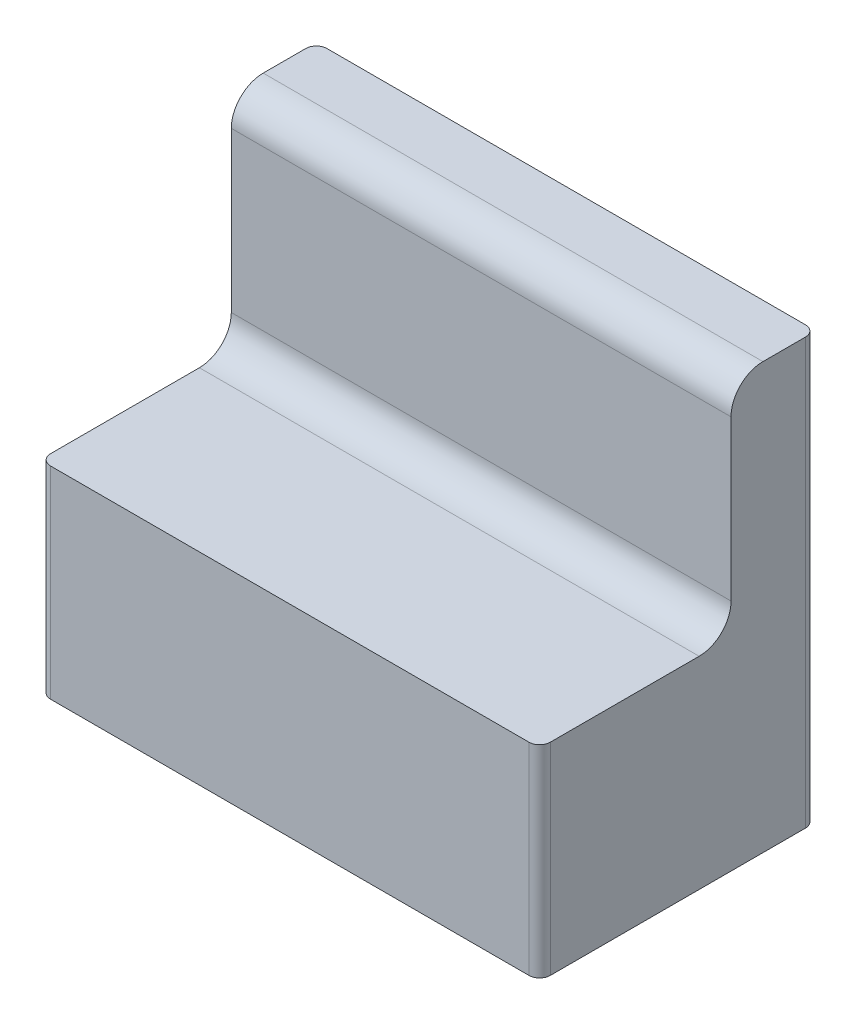
ISO-10303-21;
HEADER;
FILE_DESCRIPTION(('STEP AP214'),'2;1');
FILE_NAME('part.step','',(''),(''),'','','');
FILE_SCHEMA(('AUTOMOTIVE_DESIGN { 1 0 10303 214 1 1 1 1 }'));
ENDSEC;
DATA;
#1=APPLICATION_CONTEXT('core data for automotive mechanical design processes');
#2=APPLICATION_PROTOCOL_DEFINITION('international standard','automotive_design',2000,#1);
#3=PRODUCT_CONTEXT('',#1,'mechanical');
#4=PRODUCT('Part','Part','',(#3));
#5=PRODUCT_RELATED_PRODUCT_CATEGORY('part','',(#4));
#6=PRODUCT_DEFINITION_FORMATION('','',#4);
#7=PRODUCT_DEFINITION_CONTEXT('part definition',#1,'design');
#8=PRODUCT_DEFINITION('design','',#6,#7);
#9=PRODUCT_DEFINITION_SHAPE('','',#8);
#10=(LENGTH_UNIT() NAMED_UNIT(*) SI_UNIT(.MILLI.,.METRE.));
#11=(NAMED_UNIT(*) PLANE_ANGLE_UNIT() SI_UNIT($,.RADIAN.));
#12=(NAMED_UNIT(*) SI_UNIT($,.STERADIAN.) SOLID_ANGLE_UNIT());
#13=UNCERTAINTY_MEASURE_WITH_UNIT(LENGTH_MEASURE(1.E-05),#10,'distance_accuracy_value','');
#14=(GEOMETRIC_REPRESENTATION_CONTEXT(3) GLOBAL_UNCERTAINTY_ASSIGNED_CONTEXT((#13)) GLOBAL_UNIT_ASSIGNED_CONTEXT((#10,
#11,#12)) REPRESENTATION_CONTEXT('',''));
#15=CARTESIAN_POINT('',(0.,0.,0.));
#16=DIRECTION('',(0.,0.,1.));
#17=DIRECTION('',(1.,0.,0.));
#18=AXIS2_PLACEMENT_3D('',#15,#16,#17);
#19=CARTESIAN_POINT('',(23.5,-40.,13.));
#20=DIRECTION('',(1.,0.,0.));
#21=DIRECTION('',(0.,0.,-1.));
#22=AXIS2_PLACEMENT_3D('',#19,#20,#21);
#23=PLANE('',#22);
#24=DIRECTION('',(0.,0.,-1.));
#25=VECTOR('',#24,1.);
#26=CARTESIAN_POINT('',(23.5,-40.,13.));
#27=LINE('',#26,#25);
#28=CARTESIAN_POINT('',(23.5,-40.,12.));
#29=VERTEX_POINT('',#28);
#30=CARTESIAN_POINT('',(23.5,-40.,-12.));
#31=VERTEX_POINT('',#30);
#32=EDGE_CURVE('E187',#29,#31,#27,.T.);
#33=ORIENTED_EDGE('',*,*,#32,.T.);
#34=DIRECTION('',(0.,1.,0.));
#35=VECTOR('',#34,1.);
#36=CARTESIAN_POINT('',(23.5,-40.,-12.));
#37=LINE('',#36,#35);
#38=CARTESIAN_POINT('',(23.5,0.,-12.));
#39=VERTEX_POINT('',#38);
#40=EDGE_CURVE('E229',#31,#39,#37,.T.);
#41=ORIENTED_EDGE('',*,*,#40,.T.);
#42=DIRECTION('',(0.,0.,-1.));
#43=VECTOR('',#42,1.);
#44=CARTESIAN_POINT('',(23.5,0.,13.));
#45=LINE('',#44,#43);
#46=CARTESIAN_POINT('',(23.5,0.,-8.));
#47=VERTEX_POINT('',#46);
#48=EDGE_CURVE('E186',#47,#39,#45,.T.);
#49=ORIENTED_EDGE('',*,*,#48,.F.);
#50=CARTESIAN_POINT('',(23.5,-3.,-8.));
#51=DIRECTION('',(1.,0.,0.));
#52=DIRECTION('',(0.,0.,-1.));
#53=AXIS2_PLACEMENT_3D('',#50,#51,#52);
#54=CIRCLE('',#53,3.);
#55=CARTESIAN_POINT('',(23.5,-3.,-5.));
#56=VERTEX_POINT('',#55);
#57=EDGE_CURVE('E209',#47,#56,#54,.T.);
#58=ORIENTED_EDGE('',*,*,#57,.T.);
#59=DIRECTION('',(0.,1.,0.));
#60=VECTOR('',#59,1.);
#61=CARTESIAN_POINT('',(23.5,0.,-5.));
#62=LINE('',#61,#60);
#63=CARTESIAN_POINT('',(23.5,-18.,-5.));
#64=VERTEX_POINT('',#63);
#65=EDGE_CURVE('E178',#64,#56,#62,.T.);
#66=ORIENTED_EDGE('',*,*,#65,.F.);
#67=CARTESIAN_POINT('',(23.5,-18.,-2.));
#68=DIRECTION('',(1.,0.,0.));
#69=DIRECTION('',(0.,0.,-1.));
#70=AXIS2_PLACEMENT_3D('',#67,#68,#69);
#71=CIRCLE('',#70,3.);
#72=CARTESIAN_POINT('',(23.5,-21.,-2.));
#73=VERTEX_POINT('',#72);
#74=EDGE_CURVE('E222',#64,#73,#71,.F.);
#75=ORIENTED_EDGE('',*,*,#74,.T.);
#76=DIRECTION('',(0.,0.,-1.));
#77=VECTOR('',#76,1.);
#78=CARTESIAN_POINT('',(23.5,-21.,13.));
#79=LINE('',#78,#77);
#80=CARTESIAN_POINT('',(23.5,-21.,12.));
#81=VERTEX_POINT('',#80);
#82=EDGE_CURVE('E176',#81,#73,#79,.T.);
#83=ORIENTED_EDGE('',*,*,#82,.F.);
#84=DIRECTION('',(0.,1.,0.));
#85=VECTOR('',#84,1.);
#86=CARTESIAN_POINT('',(23.5,-40.,12.));
#87=LINE('',#86,#85);
#88=EDGE_CURVE('E227',#81,#29,#87,.F.);
#89=ORIENTED_EDGE('',*,*,#88,.T.);
#90=EDGE_LOOP('',(#33,#41,#49,#58,#66,#75,#83,#89));
#91=FACE_BOUND('',#90,.T.);
#92=ADVANCED_FACE('F53',(#91),#23,.T.);
#93=CARTESIAN_POINT('',(-23.5,-40.,13.));
#94=DIRECTION('',(0.,0.,1.));
#95=DIRECTION('',(1.,0.,0.));
#96=AXIS2_PLACEMENT_3D('',#93,#94,#95);
#97=PLANE('',#96);
#98=DIRECTION('',(1.,0.,0.));
#99=VECTOR('',#98,1.);
#100=CARTESIAN_POINT('',(-23.5,-40.,13.));
#101=LINE('',#100,#99);
#102=CARTESIAN_POINT('',(-22.5,-40.,13.));
#103=VERTEX_POINT('',#102);
#104=CARTESIAN_POINT('',(22.5,-40.,13.));
#105=VERTEX_POINT('',#104);
#106=EDGE_CURVE('E197',#103,#105,#101,.T.);
#107=ORIENTED_EDGE('',*,*,#106,.T.);
#108=DIRECTION('',(0.,1.,0.));
#109=VECTOR('',#108,1.);
#110=CARTESIAN_POINT('',(22.5,-40.,13.));
#111=LINE('',#110,#109);
#112=CARTESIAN_POINT('',(22.5,-21.,13.));
#113=VERTEX_POINT('',#112);
#114=EDGE_CURVE('E251',#105,#113,#111,.T.);
#115=ORIENTED_EDGE('',*,*,#114,.T.);
#116=DIRECTION('',(1.,0.,0.));
#117=VECTOR('',#116,1.);
#118=CARTESIAN_POINT('',(-23.501,-21.,13.));
#119=LINE('',#118,#117);
#120=CARTESIAN_POINT('',(-22.5,-21.,13.));
#121=VERTEX_POINT('',#120);
#122=EDGE_CURVE('E181',#121,#113,#119,.T.);
#123=ORIENTED_EDGE('',*,*,#122,.F.);
#124=DIRECTION('',(0.,1.,0.));
#125=VECTOR('',#124,1.);
#126=CARTESIAN_POINT('',(-22.5,-40.,13.));
#127=LINE('',#126,#125);
#128=EDGE_CURVE('E249',#121,#103,#127,.F.);
#129=ORIENTED_EDGE('',*,*,#128,.T.);
#130=EDGE_LOOP('',(#107,#115,#123,#129));
#131=FACE_BOUND('',#130,.T.);
#132=ADVANCED_FACE('F285',(#131),#97,.T.);
#133=CARTESIAN_POINT('',(-23.5,-40.,13.));
#134=DIRECTION('',(-1.,0.,0.));
#135=DIRECTION('',(0.,0.,1.));
#136=AXIS2_PLACEMENT_3D('',#133,#134,#135);
#137=PLANE('',#136);
#138=DIRECTION('',(0.,0.,1.));
#139=VECTOR('',#138,1.);
#140=CARTESIAN_POINT('',(-23.5,-40.,13.));
#141=LINE('',#140,#139);
#142=CARTESIAN_POINT('',(-23.5,-40.,-12.));
#143=VERTEX_POINT('',#142);
#144=CARTESIAN_POINT('',(-23.5,-40.,12.));
#145=VERTEX_POINT('',#144);
#146=EDGE_CURVE('E194',#143,#145,#141,.T.);
#147=ORIENTED_EDGE('',*,*,#146,.T.);
#148=DIRECTION('',(0.,1.,0.));
#149=VECTOR('',#148,1.);
#150=CARTESIAN_POINT('',(-23.5,-40.,12.));
#151=LINE('',#150,#149);
#152=CARTESIAN_POINT('',(-23.5,-21.,12.));
#153=VERTEX_POINT('',#152);
#154=EDGE_CURVE('E11',#145,#153,#151,.T.);
#155=ORIENTED_EDGE('',*,*,#154,.T.);
#156=DIRECTION('',(0.,0.,-1.));
#157=VECTOR('',#156,1.);
#158=CARTESIAN_POINT('',(-23.5,-21.,13.));
#159=LINE('',#158,#157);
#160=CARTESIAN_POINT('',(-23.5,-21.,-2.));
#161=VERTEX_POINT('',#160);
#162=EDGE_CURVE('E184',#153,#161,#159,.T.);
#163=ORIENTED_EDGE('',*,*,#162,.T.);
#164=CARTESIAN_POINT('',(-23.5,-18.,-2.));
#165=DIRECTION('',(-1.,0.,0.));
#166=DIRECTION('',(0.,0.,1.));
#167=AXIS2_PLACEMENT_3D('',#164,#165,#166);
#168=CIRCLE('',#167,3.);
#169=CARTESIAN_POINT('',(-23.5,-18.,-5.));
#170=VERTEX_POINT('',#169);
#171=EDGE_CURVE('E225',#161,#170,#168,.F.);
#172=ORIENTED_EDGE('',*,*,#171,.T.);
#173=DIRECTION('',(0.,1.,0.));
#174=VECTOR('',#173,1.);
#175=CARTESIAN_POINT('',(-23.5,0.,-5.));
#176=LINE('',#175,#174);
#177=CARTESIAN_POINT('',(-23.5,-3.,-5.));
#178=VERTEX_POINT('',#177);
#179=EDGE_CURVE('E173',#170,#178,#176,.T.);
#180=ORIENTED_EDGE('',*,*,#179,.T.);
#181=CARTESIAN_POINT('',(-23.5,-3.,-8.));
#182=DIRECTION('',(-1.,0.,0.));
#183=DIRECTION('',(0.,0.,1.));
#184=AXIS2_PLACEMENT_3D('',#181,#182,#183);
#185=CIRCLE('',#184,3.);
#186=CARTESIAN_POINT('',(-23.5,0.,-8.));
#187=VERTEX_POINT('',#186);
#188=EDGE_CURVE('E216',#178,#187,#185,.T.);
#189=ORIENTED_EDGE('',*,*,#188,.T.);
#190=DIRECTION('',(0.,0.,1.));
#191=VECTOR('',#190,1.);
#192=CARTESIAN_POINT('',(-23.5,0.,13.));
#193=LINE('',#192,#191);
#194=CARTESIAN_POINT('',(-23.5,0.,-12.));
#195=VERTEX_POINT('',#194);
#196=EDGE_CURVE('E191',#195,#187,#193,.T.);
#197=ORIENTED_EDGE('',*,*,#196,.F.);
#198=DIRECTION('',(0.,1.,0.));
#199=VECTOR('',#198,1.);
#200=CARTESIAN_POINT('',(-23.5,-40.,-12.));
#201=LINE('',#200,#199);
#202=EDGE_CURVE('E61',#195,#143,#201,.F.);
#203=ORIENTED_EDGE('',*,*,#202,.T.);
#204=EDGE_LOOP('',(#147,#155,#163,#172,#180,#189,#197,#203));
#205=FACE_BOUND('',#204,.T.);
#206=ADVANCED_FACE('F258',(#205),#137,.T.);
#207=CARTESIAN_POINT('',(-23.5,-40.,-13.));
#208=DIRECTION('',(0.,0.,-1.));
#209=DIRECTION('',(-1.,0.,0.));
#210=AXIS2_PLACEMENT_3D('',#207,#208,#209);
#211=PLANE('',#210);
#212=DIRECTION('',(-1.,0.,0.));
#213=VECTOR('',#212,1.);
#214=CARTESIAN_POINT('',(-23.5,0.,-13.));
#215=LINE('',#214,#213);
#216=CARTESIAN_POINT('',(22.5,0.,-13.));
#217=VERTEX_POINT('',#216);
#218=CARTESIAN_POINT('',(-22.5,0.,-13.));
#219=VERTEX_POINT('',#218);
#220=EDGE_CURVE('E203',#217,#219,#215,.T.);
#221=ORIENTED_EDGE('',*,*,#220,.F.);
#222=DIRECTION('',(0.,1.,0.));
#223=VECTOR('',#222,1.);
#224=CARTESIAN_POINT('',(22.5,-40.,-13.));
#225=LINE('',#224,#223);
#226=CARTESIAN_POINT('',(22.5,-40.,-13.));
#227=VERTEX_POINT('',#226);
#228=EDGE_CURVE('E239',#217,#227,#225,.F.);
#229=ORIENTED_EDGE('',*,*,#228,.T.);
#230=DIRECTION('',(-1.,0.,0.));
#231=VECTOR('',#230,1.);
#232=CARTESIAN_POINT('',(-23.5,-40.,-13.));
#233=LINE('',#232,#231);
#234=CARTESIAN_POINT('',(-22.5,-40.,-13.));
#235=VERTEX_POINT('',#234);
#236=EDGE_CURVE('E190',#227,#235,#233,.T.);
#237=ORIENTED_EDGE('',*,*,#236,.T.);
#238=DIRECTION('',(0.,1.,0.));
#239=VECTOR('',#238,1.);
#240=CARTESIAN_POINT('',(-22.5,-40.,-13.));
#241=LINE('',#240,#239);
#242=EDGE_CURVE('E236',#235,#219,#241,.T.);
#243=ORIENTED_EDGE('',*,*,#242,.T.);
#244=EDGE_LOOP('',(#221,#229,#237,#243));
#245=FACE_BOUND('',#244,.T.);
#246=ADVANCED_FACE('F269',(#245),#211,.T.);
#247=CARTESIAN_POINT('',(0.,-40.,0.));
#248=DIRECTION('',(0.,-1.,0.));
#249=DIRECTION('',(0.,0.,-1.));
#250=AXIS2_PLACEMENT_3D('',#247,#248,#249);
#251=PLANE('',#250);
#252=CARTESIAN_POINT('',(15.5,-40.,0.));
#253=DIRECTION('',(0.,-1.,0.));
#254=DIRECTION('',(0.,0.,-1.));
#255=AXIS2_PLACEMENT_3D('',#252,#253,#254);
#256=CIRCLE('',#255,3.025);
#257=CARTESIAN_POINT('',(15.5,-40.,-3.025));
#258=VERTEX_POINT('',#257);
#259=EDGE_CURVE('E164',#258,#258,#256,.T.);
#260=ORIENTED_EDGE('',*,*,#259,.F.);
#261=EDGE_LOOP('',(#260));
#262=FACE_BOUND('',#261,.T.);
#263=CARTESIAN_POINT('',(-15.5,-40.,0.));
#264=DIRECTION('',(0.,-1.,0.));
#265=DIRECTION('',(0.,0.,-1.));
#266=AXIS2_PLACEMENT_3D('',#263,#264,#265);
#267=CIRCLE('',#266,3.025);
#268=CARTESIAN_POINT('',(-15.5,-40.,-3.025));
#269=VERTEX_POINT('',#268);
#270=EDGE_CURVE('E157',#269,#269,#267,.T.);
#271=ORIENTED_EDGE('',*,*,#270,.F.);
#272=EDGE_LOOP('',(#271));
#273=FACE_BOUND('',#272,.T.);
#274=ORIENTED_EDGE('',*,*,#236,.F.);
#275=CARTESIAN_POINT('',(22.5,-40.,-12.));
#276=DIRECTION('',(0.,-1.,0.));
#277=DIRECTION('',(0.,0.,-1.));
#278=AXIS2_PLACEMENT_3D('',#275,#276,#277);
#279=CIRCLE('',#278,1.);
#280=EDGE_CURVE('E247',#227,#31,#279,.T.);
#281=ORIENTED_EDGE('',*,*,#280,.T.);
#282=ORIENTED_EDGE('',*,*,#32,.F.);
#283=CARTESIAN_POINT('',(22.5,-40.,12.));
#284=DIRECTION('',(0.,-1.,0.));
#285=DIRECTION('',(0.,0.,-1.));
#286=AXIS2_PLACEMENT_3D('',#283,#284,#285);
#287=CIRCLE('',#286,1.);
#288=EDGE_CURVE('E245',#29,#105,#287,.T.);
#289=ORIENTED_EDGE('',*,*,#288,.T.);
#290=ORIENTED_EDGE('',*,*,#106,.F.);
#291=CARTESIAN_POINT('',(-22.5,-40.,12.));
#292=DIRECTION('',(0.,-1.,0.));
#293=DIRECTION('',(0.,0.,-1.));
#294=AXIS2_PLACEMENT_3D('',#291,#292,#293);
#295=CIRCLE('',#294,1.);
#296=EDGE_CURVE('E243',#103,#145,#295,.T.);
#297=ORIENTED_EDGE('',*,*,#296,.T.);
#298=ORIENTED_EDGE('',*,*,#146,.F.);
#299=CARTESIAN_POINT('',(-22.5,-40.,-12.));
#300=DIRECTION('',(0.,-1.,0.));
#301=DIRECTION('',(0.,0.,-1.));
#302=AXIS2_PLACEMENT_3D('',#299,#300,#301);
#303=CIRCLE('',#302,1.);
#304=EDGE_CURVE('E241',#143,#235,#303,.T.);
#305=ORIENTED_EDGE('',*,*,#304,.T.);
#306=EDGE_LOOP('',(#274,#281,#282,#289,#290,#297,#298,#305));
#307=FACE_BOUND('',#306,.T.);
#308=ADVANCED_FACE('F263',(#262,#273,#307),#251,.T.);
#309=CARTESIAN_POINT('',(0.,0.,0.));
#310=DIRECTION('',(0.,-1.,0.));
#311=DIRECTION('',(0.,0.,-1.));
#312=AXIS2_PLACEMENT_3D('',#309,#310,#311);
#313=PLANE('',#312);
#314=ORIENTED_EDGE('',*,*,#48,.T.);
#315=CARTESIAN_POINT('',(22.5,0.,-12.));
#316=DIRECTION('',(0.,-1.,0.));
#317=DIRECTION('',(0.,0.,-1.));
#318=AXIS2_PLACEMENT_3D('',#315,#316,#317);
#319=CIRCLE('',#318,1.);
#320=EDGE_CURVE('E234',#39,#217,#319,.F.);
#321=ORIENTED_EDGE('',*,*,#320,.T.);
#322=ORIENTED_EDGE('',*,*,#220,.T.);
#323=CARTESIAN_POINT('',(-22.5,0.,-12.));
#324=DIRECTION('',(0.,-1.,0.));
#325=DIRECTION('',(0.,0.,-1.));
#326=AXIS2_PLACEMENT_3D('',#323,#324,#325);
#327=CIRCLE('',#326,1.);
#328=EDGE_CURVE('E232',#219,#195,#327,.F.);
#329=ORIENTED_EDGE('',*,*,#328,.T.);
#330=ORIENTED_EDGE('',*,*,#196,.T.);
#331=DIRECTION('',(1.,0.,0.));
#332=VECTOR('',#331,1.);
#333=CARTESIAN_POINT('',(0.,0.,-8.));
#334=LINE('',#333,#332);
#335=EDGE_CURVE('E200',#187,#47,#334,.T.);
#336=ORIENTED_EDGE('',*,*,#335,.T.);
#337=EDGE_LOOP('',(#314,#321,#322,#329,#330,#336));
#338=FACE_BOUND('',#337,.T.);
#339=ADVANCED_FACE('F272',(#338),#313,.F.);
#340=CARTESIAN_POINT('',(-23.501,0.,-5.));
#341=DIRECTION('',(0.,0.,-1.));
#342=DIRECTION('',(0.,1.,0.));
#343=AXIS2_PLACEMENT_3D('',#340,#341,#342);
#344=PLANE('',#343);
#345=ORIENTED_EDGE('',*,*,#65,.T.);
#346=DIRECTION('',(1.,0.,0.));
#347=VECTOR('',#346,1.);
#348=CARTESIAN_POINT('',(-23.501,-3.,-5.));
#349=LINE('',#348,#347);
#350=EDGE_CURVE('E214',#56,#178,#349,.F.);
#351=ORIENTED_EDGE('',*,*,#350,.T.);
#352=ORIENTED_EDGE('',*,*,#179,.F.);
#353=DIRECTION('',(1.,0.,0.));
#354=VECTOR('',#353,1.);
#355=CARTESIAN_POINT('',(23.5,-18.,-5.));
#356=LINE('',#355,#354);
#357=EDGE_CURVE('E211',#170,#64,#356,.T.);
#358=ORIENTED_EDGE('',*,*,#357,.T.);
#359=EDGE_LOOP('',(#345,#351,#352,#358));
#360=FACE_BOUND('',#359,.T.);
#361=ADVANCED_FACE('F344',(#360),#344,.F.);
#362=CARTESIAN_POINT('',(-23.501,-21.,13.));
#363=DIRECTION('',(0.,-1.,0.));
#364=DIRECTION('',(0.,0.,-1.));
#365=AXIS2_PLACEMENT_3D('',#362,#363,#364);
#366=PLANE('',#365);
#367=ORIENTED_EDGE('',*,*,#122,.T.);
#368=CARTESIAN_POINT('',(22.5,-21.,12.));
#369=DIRECTION('',(0.,-1.,0.));
#370=DIRECTION('',(0.,0.,-1.));
#371=AXIS2_PLACEMENT_3D('',#368,#369,#370);
#372=CIRCLE('',#371,1.);
#373=EDGE_CURVE('E75',#113,#81,#372,.F.);
#374=ORIENTED_EDGE('',*,*,#373,.T.);
#375=ORIENTED_EDGE('',*,*,#82,.T.);
#376=DIRECTION('',(1.,0.,0.));
#377=VECTOR('',#376,1.);
#378=CARTESIAN_POINT('',(-23.5,-21.,-2.));
#379=LINE('',#378,#377);
#380=EDGE_CURVE('E219',#73,#161,#379,.F.);
#381=ORIENTED_EDGE('',*,*,#380,.T.);
#382=ORIENTED_EDGE('',*,*,#162,.F.);
#383=CARTESIAN_POINT('',(-22.5,-21.,12.));
#384=DIRECTION('',(0.,-1.,0.));
#385=DIRECTION('',(0.,0.,-1.));
#386=AXIS2_PLACEMENT_3D('',#383,#384,#385);
#387=CIRCLE('',#386,1.);
#388=EDGE_CURVE('E68',#153,#121,#387,.F.);
#389=ORIENTED_EDGE('',*,*,#388,.T.);
#390=EDGE_LOOP('',(#367,#374,#375,#381,#382,#389));
#391=FACE_BOUND('',#390,.T.);
#392=ADVANCED_FACE('F287',(#391),#366,.F.);
#393=CARTESIAN_POINT('',(0.,-3.,-8.));
#394=DIRECTION('',(1.,0.,0.));
#395=DIRECTION('',(0.,0.,-1.));
#396=AXIS2_PLACEMENT_3D('',#393,#394,#395);
#397=CYLINDRICAL_SURFACE('',#396,3.);
#398=ORIENTED_EDGE('',*,*,#188,.F.);
#399=ORIENTED_EDGE('',*,*,#350,.F.);
#400=ORIENTED_EDGE('',*,*,#57,.F.);
#401=ORIENTED_EDGE('',*,*,#335,.F.);
#402=EDGE_LOOP('',(#398,#399,#400,#401));
#403=FACE_BOUND('',#402,.T.);
#404=ADVANCED_FACE('F309',(#403),#397,.T.);
#405=CARTESIAN_POINT('',(-23.501,-18.,-2.));
#406=DIRECTION('',(-1.,0.,0.));
#407=DIRECTION('',(0.,0.,1.));
#408=AXIS2_PLACEMENT_3D('',#405,#406,#407);
#409=CYLINDRICAL_SURFACE('',#408,3.);
#410=ORIENTED_EDGE('',*,*,#171,.F.);
#411=ORIENTED_EDGE('',*,*,#380,.F.);
#412=ORIENTED_EDGE('',*,*,#74,.F.);
#413=ORIENTED_EDGE('',*,*,#357,.F.);
#414=EDGE_LOOP('',(#410,#411,#412,#413));
#415=FACE_BOUND('',#414,.T.);
#416=ADVANCED_FACE('F312',(#415),#409,.F.);
#417=CARTESIAN_POINT('',(-15.5,-25.,0.));
#418=DIRECTION('',(0.,-1.,0.));
#419=DIRECTION('',(0.,0.,-1.));
#420=AXIS2_PLACEMENT_3D('',#417,#418,#419);
#421=CONICAL_SURFACE('',#420,2.5,1.02974425867665);
#422=CARTESIAN_POINT('',(-15.5,-23.4978484524311,0.));
#423=VERTEX_POINT('',#422);
#424=VERTEX_LOOP('',#423);
#425=FACE_BOUND('',#424,.T.);
#426=CARTESIAN_POINT('',(-15.5,-25.,0.));
#427=DIRECTION('',(0.,-1.,0.));
#428=DIRECTION('',(0.,0.,-1.));
#429=AXIS2_PLACEMENT_3D('',#426,#427,#428);
#430=CIRCLE('',#429,2.5);
#431=CARTESIAN_POINT('',(-15.5,-25.,-2.5));
#432=VERTEX_POINT('',#431);
#433=EDGE_CURVE('E170',#432,#432,#430,.T.);
#434=ORIENTED_EDGE('',*,*,#433,.T.);
#435=EDGE_LOOP('',(#434));
#436=FACE_BOUND('',#435,.T.);
#437=ADVANCED_FACE('F316',(#425,#436),#421,.F.);
#438=CARTESIAN_POINT('',(-15.5,-40.,0.));
#439=DIRECTION('',(0.,-1.,0.));
#440=DIRECTION('',(0.,0.,-1.));
#441=AXIS2_PLACEMENT_3D('',#438,#439,#440);
#442=CYLINDRICAL_SURFACE('',#441,2.49999999999999);
#443=ORIENTED_EDGE('',*,*,#433,.F.);
#444=EDGE_LOOP('',(#443));
#445=FACE_BOUND('',#444,.T.);
#446=CARTESIAN_POINT('',(-15.5,-39.475,0.));
#447=DIRECTION('',(0.,-1.,0.));
#448=DIRECTION('',(0.,0.,-1.));
#449=AXIS2_PLACEMENT_3D('',#446,#447,#448);
#450=CIRCLE('',#449,2.49999999999999);
#451=CARTESIAN_POINT('',(-15.5,-39.475,-2.49999999999999));
#452=VERTEX_POINT('',#451);
#453=EDGE_CURVE('E161',#452,#452,#450,.T.);
#454=ORIENTED_EDGE('',*,*,#453,.T.);
#455=EDGE_LOOP('',(#454));
#456=FACE_BOUND('',#455,.T.);
#457=ADVANCED_FACE('F336',(#445,#456),#442,.F.);
#458=CARTESIAN_POINT('',(-15.5,-40.,0.));
#459=DIRECTION('',(0.,-1.,0.));
#460=DIRECTION('',(0.,0.,-1.));
#461=AXIS2_PLACEMENT_3D('',#458,#459,#460);
#462=CONICAL_SURFACE('',#461,3.025,0.785398163397447);
#463=ORIENTED_EDGE('',*,*,#453,.F.);
#464=EDGE_LOOP('',(#463));
#465=FACE_BOUND('',#464,.T.);
#466=ORIENTED_EDGE('',*,*,#270,.T.);
#467=EDGE_LOOP('',(#466));
#468=FACE_BOUND('',#467,.T.);
#469=ADVANCED_FACE('F151',(#465,#468),#462,.F.);
#470=CARTESIAN_POINT('',(15.5,-25.,0.));
#471=DIRECTION('',(0.,-1.,0.));
#472=DIRECTION('',(0.,0.,-1.));
#473=AXIS2_PLACEMENT_3D('',#470,#471,#472);
#474=CONICAL_SURFACE('',#473,2.5,1.02974425867665);
#475=CARTESIAN_POINT('',(15.5,-23.4978484524311,0.));
#476=VERTEX_POINT('',#475);
#477=VERTEX_LOOP('',#476);
#478=FACE_BOUND('',#477,.T.);
#479=CARTESIAN_POINT('',(15.5,-25.,0.));
#480=DIRECTION('',(0.,-1.,0.));
#481=DIRECTION('',(0.,0.,-1.));
#482=AXIS2_PLACEMENT_3D('',#479,#480,#481);
#483=CIRCLE('',#482,2.5);
#484=CARTESIAN_POINT('',(15.5,-25.,-2.5));
#485=VERTEX_POINT('',#484);
#486=EDGE_CURVE('E155',#485,#485,#483,.T.);
#487=ORIENTED_EDGE('',*,*,#486,.T.);
#488=EDGE_LOOP('',(#487));
#489=FACE_BOUND('',#488,.T.);
#490=ADVANCED_FACE('F147',(#478,#489),#474,.F.);
#491=CARTESIAN_POINT('',(15.5,-40.,0.));
#492=DIRECTION('',(0.,-1.,0.));
#493=DIRECTION('',(0.,0.,-1.));
#494=AXIS2_PLACEMENT_3D('',#491,#492,#493);
#495=CYLINDRICAL_SURFACE('',#494,2.49999999999999);
#496=ORIENTED_EDGE('',*,*,#486,.F.);
#497=EDGE_LOOP('',(#496));
#498=FACE_BOUND('',#497,.T.);
#499=CARTESIAN_POINT('',(15.5,-39.475,0.));
#500=DIRECTION('',(0.,-1.,0.));
#501=DIRECTION('',(0.,0.,-1.));
#502=AXIS2_PLACEMENT_3D('',#499,#500,#501);
#503=CIRCLE('',#502,2.49999999999999);
#504=CARTESIAN_POINT('',(15.5,-39.475,-2.49999999999999));
#505=VERTEX_POINT('',#504);
#506=EDGE_CURVE('E158',#505,#505,#503,.T.);
#507=ORIENTED_EDGE('',*,*,#506,.T.);
#508=EDGE_LOOP('',(#507));
#509=FACE_BOUND('',#508,.T.);
#510=ADVANCED_FACE('F150',(#498,#509),#495,.F.);
#511=CARTESIAN_POINT('',(15.5,-40.,0.));
#512=DIRECTION('',(0.,-1.,0.));
#513=DIRECTION('',(0.,0.,-1.));
#514=AXIS2_PLACEMENT_3D('',#511,#512,#513);
#515=CONICAL_SURFACE('',#514,3.025,0.785398163397445);
#516=ORIENTED_EDGE('',*,*,#506,.F.);
#517=EDGE_LOOP('',(#516));
#518=FACE_BOUND('',#517,.T.);
#519=ORIENTED_EDGE('',*,*,#259,.T.);
#520=EDGE_LOOP('',(#519));
#521=FACE_BOUND('',#520,.T.);
#522=ADVANCED_FACE('F319',(#518,#521),#515,.F.);
#523=CARTESIAN_POINT('',(22.5,-40.,-12.));
#524=DIRECTION('',(0.,1.,0.));
#525=DIRECTION('',(0.,0.,1.));
#526=AXIS2_PLACEMENT_3D('',#523,#524,#525);
#527=CYLINDRICAL_SURFACE('',#526,1.);
#528=ORIENTED_EDGE('',*,*,#280,.F.);
#529=ORIENTED_EDGE('',*,*,#228,.F.);
#530=ORIENTED_EDGE('',*,*,#320,.F.);
#531=ORIENTED_EDGE('',*,*,#40,.F.);
#532=EDGE_LOOP('',(#528,#529,#530,#531));
#533=FACE_BOUND('',#532,.T.);
#534=ADVANCED_FACE('F277',(#533),#527,.T.);
#535=CARTESIAN_POINT('',(22.5,-40.,12.));
#536=DIRECTION('',(0.,1.,0.));
#537=DIRECTION('',(0.,0.,1.));
#538=AXIS2_PLACEMENT_3D('',#535,#536,#537);
#539=CYLINDRICAL_SURFACE('',#538,1.);
#540=ORIENTED_EDGE('',*,*,#288,.F.);
#541=ORIENTED_EDGE('',*,*,#88,.F.);
#542=ORIENTED_EDGE('',*,*,#373,.F.);
#543=ORIENTED_EDGE('',*,*,#114,.F.);
#544=EDGE_LOOP('',(#540,#541,#542,#543));
#545=FACE_BOUND('',#544,.T.);
#546=ADVANCED_FACE('F282',(#545),#539,.T.);
#547=CARTESIAN_POINT('',(-22.5,-40.,12.));
#548=DIRECTION('',(0.,1.,0.));
#549=DIRECTION('',(0.,0.,1.));
#550=AXIS2_PLACEMENT_3D('',#547,#548,#549);
#551=CYLINDRICAL_SURFACE('',#550,1.);
#552=ORIENTED_EDGE('',*,*,#296,.F.);
#553=ORIENTED_EDGE('',*,*,#128,.F.);
#554=ORIENTED_EDGE('',*,*,#388,.F.);
#555=ORIENTED_EDGE('',*,*,#154,.F.);
#556=EDGE_LOOP('',(#552,#553,#554,#555));
#557=FACE_BOUND('',#556,.T.);
#558=ADVANCED_FACE('F292',(#557),#551,.T.);
#559=CARTESIAN_POINT('',(-22.5,-40.,-12.));
#560=DIRECTION('',(0.,1.,0.));
#561=DIRECTION('',(0.,0.,1.));
#562=AXIS2_PLACEMENT_3D('',#559,#560,#561);
#563=CYLINDRICAL_SURFACE('',#562,1.);
#564=ORIENTED_EDGE('',*,*,#304,.F.);
#565=ORIENTED_EDGE('',*,*,#202,.F.);
#566=ORIENTED_EDGE('',*,*,#328,.F.);
#567=ORIENTED_EDGE('',*,*,#242,.F.);
#568=EDGE_LOOP('',(#564,#565,#566,#567));
#569=FACE_BOUND('',#568,.T.);
#570=ADVANCED_FACE('F55',(#569),#563,.T.);
#571=CLOSED_SHELL('',(#92,#132,#206,#246,#308,#339,#361,#392,#404,#416,#437,#457,#469,#490,#510,
#522,#534,#546,#558,#570));
#572=MANIFOLD_SOLID_BREP('B2',#571);
#573=ADVANCED_BREP_SHAPE_REPRESENTATION('',(#18,#572),#14);
#574=SHAPE_DEFINITION_REPRESENTATION(#9,#573);
ENDSEC;
END-ISO-10303-21;
